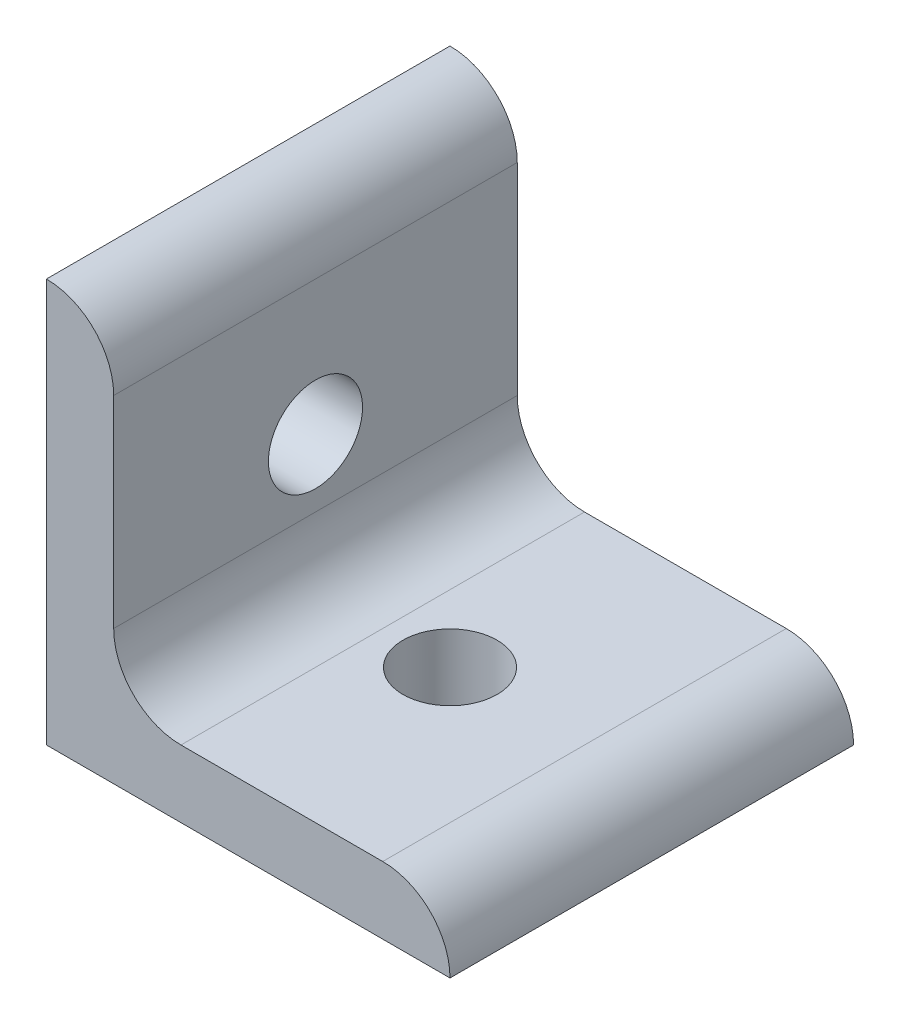
ISO-10303-21;
HEADER;
FILE_DESCRIPTION(('STEP AP214'),'2;1');
FILE_NAME('part.step','',(''),(''),'','','');
FILE_SCHEMA(('AUTOMOTIVE_DESIGN { 1 0 10303 214 1 1 1 1 }'));
ENDSEC;
DATA;
#1=APPLICATION_CONTEXT('core data for automotive mechanical design processes');
#2=APPLICATION_PROTOCOL_DEFINITION('international standard','automotive_design',2000,#1);
#3=PRODUCT_CONTEXT('',#1,'mechanical');
#4=PRODUCT('Part','Part','',(#3));
#5=PRODUCT_RELATED_PRODUCT_CATEGORY('part','',(#4));
#6=PRODUCT_DEFINITION_FORMATION('','',#4);
#7=PRODUCT_DEFINITION_CONTEXT('part definition',#1,'design');
#8=PRODUCT_DEFINITION('design','',#6,#7);
#9=PRODUCT_DEFINITION_SHAPE('','',#8);
#10=(LENGTH_UNIT() NAMED_UNIT(*) SI_UNIT(.MILLI.,.METRE.));
#11=(NAMED_UNIT(*) PLANE_ANGLE_UNIT() SI_UNIT($,.RADIAN.));
#12=(NAMED_UNIT(*) SI_UNIT($,.STERADIAN.) SOLID_ANGLE_UNIT());
#13=UNCERTAINTY_MEASURE_WITH_UNIT(LENGTH_MEASURE(1.E-05),#10,'distance_accuracy_value','');
#14=(GEOMETRIC_REPRESENTATION_CONTEXT(3) GLOBAL_UNCERTAINTY_ASSIGNED_CONTEXT((#13)) GLOBAL_UNIT_ASSIGNED_CONTEXT((#10,
#11,#12)) REPRESENTATION_CONTEXT('',''));
#15=CARTESIAN_POINT('',(0.,0.,0.));
#16=DIRECTION('',(0.,0.,1.));
#17=DIRECTION('',(1.,0.,0.));
#18=AXIS2_PLACEMENT_3D('',#15,#16,#17);
#19=CARTESIAN_POINT('',(5.,25.,15.));
#20=DIRECTION('',(-1.,0.,0.));
#21=DIRECTION('',(0.,-1.,0.));
#22=AXIS2_PLACEMENT_3D('',#19,#20,#21);
#23=PLANE('',#22);
#24=DIRECTION('',(0.,1.,0.));
#25=VECTOR('',#24,1.);
#26=CARTESIAN_POINT('',(5.,25.,-15.));
#27=LINE('',#26,#25);
#28=CARTESIAN_POINT('',(5.,10.,-15.));
#29=VERTEX_POINT('',#28);
#30=CARTESIAN_POINT('',(5.,25.,-15.));
#31=VERTEX_POINT('',#30);
#32=EDGE_CURVE('E114',#29,#31,#27,.T.);
#33=ORIENTED_EDGE('',*,*,#32,.T.);
#34=DIRECTION('',(0.,0.,-1.));
#35=VECTOR('',#34,1.);
#36=CARTESIAN_POINT('',(5.,25.,15.));
#37=LINE('',#36,#35);
#38=CARTESIAN_POINT('',(5.,25.,15.));
#39=VERTEX_POINT('',#38);
#40=EDGE_CURVE('E111',#39,#31,#37,.T.);
#41=ORIENTED_EDGE('',*,*,#40,.F.);
#42=DIRECTION('',(0.,1.,0.));
#43=VECTOR('',#42,1.);
#44=CARTESIAN_POINT('',(5.,25.,15.));
#45=LINE('',#44,#43);
#46=CARTESIAN_POINT('',(5.,10.,15.));
#47=VERTEX_POINT('',#46);
#48=EDGE_CURVE('E100',#47,#39,#45,.T.);
#49=ORIENTED_EDGE('',*,*,#48,.F.);
#50=DIRECTION('',(0.,0.,-1.));
#51=VECTOR('',#50,1.);
#52=CARTESIAN_POINT('',(5.,10.,15.));
#53=LINE('',#52,#51);
#54=EDGE_CURVE('E115',#47,#29,#53,.T.);
#55=ORIENTED_EDGE('',*,*,#54,.T.);
#56=EDGE_LOOP('',(#33,#41,#49,#55));
#57=FACE_BOUND('',#56,.T.);
#58=CARTESIAN_POINT('',(5.,15.,0.));
#59=DIRECTION('',(-1.,0.,0.));
#60=DIRECTION('',(0.,-1.,0.));
#61=AXIS2_PLACEMENT_3D('',#58,#59,#60);
#62=CIRCLE('',#61,3.5);
#63=CARTESIAN_POINT('',(5.,11.5,0.));
#64=VERTEX_POINT('',#63);
#65=EDGE_CURVE('E164',#64,#64,#62,.F.);
#66=ORIENTED_EDGE('',*,*,#65,.F.);
#67=EDGE_LOOP('',(#66));
#68=FACE_BOUND('',#67,.T.);
#69=ADVANCED_FACE('F32',(#57,#68),#23,.F.);
#70=CARTESIAN_POINT('',(0.,0.,15.));
#71=DIRECTION('',(1.,0.,0.));
#72=DIRECTION('',(0.,0.,-1.));
#73=AXIS2_PLACEMENT_3D('',#70,#71,#72);
#74=PLANE('',#73);
#75=DIRECTION('',(0.,-1.,0.));
#76=VECTOR('',#75,1.);
#77=CARTESIAN_POINT('',(0.,0.,-15.));
#78=LINE('',#77,#76);
#79=CARTESIAN_POINT('',(0.,30.,-15.));
#80=VERTEX_POINT('',#79);
#81=CARTESIAN_POINT('',(0.,0.,-15.));
#82=VERTEX_POINT('',#81);
#83=EDGE_CURVE('E82',#80,#82,#78,.T.);
#84=ORIENTED_EDGE('',*,*,#83,.T.);
#85=DIRECTION('',(0.,0.,-1.));
#86=VECTOR('',#85,1.);
#87=CARTESIAN_POINT('',(0.,0.,15.));
#88=LINE('',#87,#86);
#89=CARTESIAN_POINT('',(0.,0.,15.));
#90=VERTEX_POINT('',#89);
#91=EDGE_CURVE('E120',#90,#82,#88,.T.);
#92=ORIENTED_EDGE('',*,*,#91,.F.);
#93=DIRECTION('',(0.,-1.,0.));
#94=VECTOR('',#93,1.);
#95=CARTESIAN_POINT('',(0.,0.,15.));
#96=LINE('',#95,#94);
#97=CARTESIAN_POINT('',(0.,30.,15.));
#98=VERTEX_POINT('',#97);
#99=EDGE_CURVE('E50',#98,#90,#96,.T.);
#100=ORIENTED_EDGE('',*,*,#99,.F.);
#101=DIRECTION('',(0.,0.,-1.));
#102=VECTOR('',#101,1.);
#103=CARTESIAN_POINT('',(0.,30.,15.));
#104=LINE('',#103,#102);
#105=EDGE_CURVE('E116',#98,#80,#104,.T.);
#106=ORIENTED_EDGE('',*,*,#105,.T.);
#107=EDGE_LOOP('',(#84,#92,#100,#106));
#108=FACE_BOUND('',#107,.T.);
#109=CARTESIAN_POINT('',(0.,15.,0.));
#110=DIRECTION('',(1.,0.,0.));
#111=DIRECTION('',(0.,0.,-1.));
#112=AXIS2_PLACEMENT_3D('',#109,#110,#111);
#113=CIRCLE('',#112,3.5);
#114=CARTESIAN_POINT('',(0.,15.,-3.5));
#115=VERTEX_POINT('',#114);
#116=EDGE_CURVE('E167',#115,#115,#113,.T.);
#117=ORIENTED_EDGE('',*,*,#116,.T.);
#118=EDGE_LOOP('',(#117));
#119=FACE_BOUND('',#118,.T.);
#120=ADVANCED_FACE('F171',(#108,#119),#74,.F.);
#121=CARTESIAN_POINT('',(30.,0.,15.));
#122=DIRECTION('',(0.,1.,0.));
#123=DIRECTION('',(-1.,0.,0.));
#124=AXIS2_PLACEMENT_3D('',#121,#122,#123);
#125=PLANE('',#124);
#126=DIRECTION('',(1.,0.,0.));
#127=VECTOR('',#126,1.);
#128=CARTESIAN_POINT('',(30.,0.,-15.));
#129=LINE('',#128,#127);
#130=CARTESIAN_POINT('',(30.,0.,-15.));
#131=VERTEX_POINT('',#130);
#132=EDGE_CURVE('E124',#82,#131,#129,.T.);
#133=ORIENTED_EDGE('',*,*,#132,.T.);
#134=DIRECTION('',(0.,0.,-1.));
#135=VECTOR('',#134,1.);
#136=CARTESIAN_POINT('',(30.,0.,15.));
#137=LINE('',#136,#135);
#138=CARTESIAN_POINT('',(30.,0.,15.));
#139=VERTEX_POINT('',#138);
#140=EDGE_CURVE('E11',#139,#131,#137,.T.);
#141=ORIENTED_EDGE('',*,*,#140,.F.);
#142=DIRECTION('',(1.,0.,0.));
#143=VECTOR('',#142,1.);
#144=CARTESIAN_POINT('',(30.,0.,15.));
#145=LINE('',#144,#143);
#146=EDGE_CURVE('E136',#90,#139,#145,.T.);
#147=ORIENTED_EDGE('',*,*,#146,.F.);
#148=ORIENTED_EDGE('',*,*,#91,.T.);
#149=EDGE_LOOP('',(#133,#141,#147,#148));
#150=FACE_BOUND('',#149,.T.);
#151=CARTESIAN_POINT('',(15.,0.,0.));
#152=DIRECTION('',(0.,1.,0.));
#153=DIRECTION('',(0.,0.,1.));
#154=AXIS2_PLACEMENT_3D('',#151,#152,#153);
#155=CIRCLE('',#154,3.5);
#156=CARTESIAN_POINT('',(15.,0.,3.5));
#157=VERTEX_POINT('',#156);
#158=EDGE_CURVE('E161',#157,#157,#155,.T.);
#159=ORIENTED_EDGE('',*,*,#158,.T.);
#160=EDGE_LOOP('',(#159));
#161=FACE_BOUND('',#160,.T.);
#162=ADVANCED_FACE('F34',(#150,#161),#125,.F.);
#163=CARTESIAN_POINT('',(10.,5.,15.));
#164=DIRECTION('',(0.,-1.,0.));
#165=DIRECTION('',(1.,0.,0.));
#166=AXIS2_PLACEMENT_3D('',#163,#164,#165);
#167=PLANE('',#166);
#168=DIRECTION('',(-1.,0.,0.));
#169=VECTOR('',#168,1.);
#170=CARTESIAN_POINT('',(10.,5.,-15.));
#171=LINE('',#170,#169);
#172=CARTESIAN_POINT('',(25.,5.,-15.));
#173=VERTEX_POINT('',#172);
#174=CARTESIAN_POINT('',(10.,5.,-15.));
#175=VERTEX_POINT('',#174);
#176=EDGE_CURVE('E129',#173,#175,#171,.T.);
#177=ORIENTED_EDGE('',*,*,#176,.T.);
#178=DIRECTION('',(0.,0.,-1.));
#179=VECTOR('',#178,1.);
#180=CARTESIAN_POINT('',(10.,5.,15.));
#181=LINE('',#180,#179);
#182=CARTESIAN_POINT('',(10.,5.,15.));
#183=VERTEX_POINT('',#182);
#184=EDGE_CURVE('E140',#183,#175,#181,.T.);
#185=ORIENTED_EDGE('',*,*,#184,.F.);
#186=DIRECTION('',(-1.,0.,0.));
#187=VECTOR('',#186,1.);
#188=CARTESIAN_POINT('',(10.,5.,15.));
#189=LINE('',#188,#187);
#190=CARTESIAN_POINT('',(25.,5.,15.));
#191=VERTEX_POINT('',#190);
#192=EDGE_CURVE('E150',#191,#183,#189,.T.);
#193=ORIENTED_EDGE('',*,*,#192,.F.);
#194=DIRECTION('',(0.,0.,-1.));
#195=VECTOR('',#194,1.);
#196=CARTESIAN_POINT('',(25.,5.,15.));
#197=LINE('',#196,#195);
#198=EDGE_CURVE('E42',#191,#173,#197,.T.);
#199=ORIENTED_EDGE('',*,*,#198,.T.);
#200=EDGE_LOOP('',(#177,#185,#193,#199));
#201=FACE_BOUND('',#200,.T.);
#202=CARTESIAN_POINT('',(15.,5.,0.));
#203=DIRECTION('',(0.,-1.,0.));
#204=DIRECTION('',(1.,0.,0.));
#205=AXIS2_PLACEMENT_3D('',#202,#203,#204);
#206=CIRCLE('',#205,3.5);
#207=CARTESIAN_POINT('',(18.5,5.,0.));
#208=VERTEX_POINT('',#207);
#209=EDGE_CURVE('E36',#208,#208,#206,.F.);
#210=ORIENTED_EDGE('',*,*,#209,.F.);
#211=EDGE_LOOP('',(#210));
#212=FACE_BOUND('',#211,.T.);
#213=ADVANCED_FACE('F147',(#201,#212),#167,.F.);
#214=CARTESIAN_POINT('',(25.,0.,15.));
#215=DIRECTION('',(0.,0.,-1.));
#216=DIRECTION('',(-1.,0.,0.));
#217=AXIS2_PLACEMENT_3D('',#214,#215,#216);
#218=CYLINDRICAL_SURFACE('',#217,5.);
#219=CARTESIAN_POINT('',(25.,0.,-15.));
#220=DIRECTION('',(0.,0.,1.));
#221=DIRECTION('',(1.,0.,0.));
#222=AXIS2_PLACEMENT_3D('',#219,#220,#221);
#223=CIRCLE('',#222,5.);
#224=EDGE_CURVE('E127',#131,#173,#223,.T.);
#225=ORIENTED_EDGE('',*,*,#224,.T.);
#226=ORIENTED_EDGE('',*,*,#198,.F.);
#227=CARTESIAN_POINT('',(25.,0.,15.));
#228=DIRECTION('',(0.,0.,1.));
#229=DIRECTION('',(1.,0.,0.));
#230=AXIS2_PLACEMENT_3D('',#227,#228,#229);
#231=CIRCLE('',#230,5.);
#232=EDGE_CURVE('E90',#139,#191,#231,.T.);
#233=ORIENTED_EDGE('',*,*,#232,.F.);
#234=ORIENTED_EDGE('',*,*,#140,.T.);
#235=EDGE_LOOP('',(#225,#226,#233,#234));
#236=FACE_BOUND('',#235,.T.);
#237=ADVANCED_FACE('F189',(#236),#218,.T.);
#238=CARTESIAN_POINT('',(10.,10.,15.));
#239=DIRECTION('',(0.,0.,-1.));
#240=DIRECTION('',(-1.,0.,0.));
#241=AXIS2_PLACEMENT_3D('',#238,#239,#240);
#242=CYLINDRICAL_SURFACE('',#241,5.);
#243=CARTESIAN_POINT('',(10.,10.,-15.));
#244=DIRECTION('',(0.,0.,-1.));
#245=DIRECTION('',(1.,0.,0.));
#246=AXIS2_PLACEMENT_3D('',#243,#244,#245);
#247=CIRCLE('',#246,5.);
#248=EDGE_CURVE('E131',#175,#29,#247,.T.);
#249=ORIENTED_EDGE('',*,*,#248,.T.);
#250=ORIENTED_EDGE('',*,*,#54,.F.);
#251=CARTESIAN_POINT('',(10.,10.,15.));
#252=DIRECTION('',(0.,0.,-1.));
#253=DIRECTION('',(1.,0.,0.));
#254=AXIS2_PLACEMENT_3D('',#251,#252,#253);
#255=CIRCLE('',#254,5.);
#256=EDGE_CURVE('E106',#183,#47,#255,.T.);
#257=ORIENTED_EDGE('',*,*,#256,.F.);
#258=ORIENTED_EDGE('',*,*,#184,.T.);
#259=EDGE_LOOP('',(#249,#250,#257,#258));
#260=FACE_BOUND('',#259,.T.);
#261=ADVANCED_FACE('F156',(#260),#242,.F.);
#262=CARTESIAN_POINT('',(0.,25.,15.));
#263=DIRECTION('',(0.,0.,-1.));
#264=DIRECTION('',(-1.,0.,0.));
#265=AXIS2_PLACEMENT_3D('',#262,#263,#264);
#266=CYLINDRICAL_SURFACE('',#265,5.);
#267=CARTESIAN_POINT('',(0.,25.,-15.));
#268=DIRECTION('',(0.,0.,1.));
#269=DIRECTION('',(1.,0.,0.));
#270=AXIS2_PLACEMENT_3D('',#267,#268,#269);
#271=CIRCLE('',#270,5.);
#272=EDGE_CURVE('E76',#31,#80,#271,.T.);
#273=ORIENTED_EDGE('',*,*,#272,.T.);
#274=ORIENTED_EDGE('',*,*,#105,.F.);
#275=CARTESIAN_POINT('',(0.,25.,15.));
#276=DIRECTION('',(0.,0.,1.));
#277=DIRECTION('',(1.,0.,0.));
#278=AXIS2_PLACEMENT_3D('',#275,#276,#277);
#279=CIRCLE('',#278,5.);
#280=EDGE_CURVE('E104',#39,#98,#279,.T.);
#281=ORIENTED_EDGE('',*,*,#280,.F.);
#282=ORIENTED_EDGE('',*,*,#40,.T.);
#283=EDGE_LOOP('',(#273,#274,#281,#282));
#284=FACE_BOUND('',#283,.T.);
#285=ADVANCED_FACE('F118',(#284),#266,.T.);
#286=CARTESIAN_POINT('',(0.,25.,15.));
#287=DIRECTION('',(0.,0.,1.));
#288=DIRECTION('',(1.,0.,0.));
#289=AXIS2_PLACEMENT_3D('',#286,#287,#288);
#290=PLANE('',#289);
#291=ORIENTED_EDGE('',*,*,#146,.T.);
#292=ORIENTED_EDGE('',*,*,#232,.T.);
#293=ORIENTED_EDGE('',*,*,#192,.T.);
#294=ORIENTED_EDGE('',*,*,#256,.T.);
#295=ORIENTED_EDGE('',*,*,#48,.T.);
#296=ORIENTED_EDGE('',*,*,#280,.T.);
#297=ORIENTED_EDGE('',*,*,#99,.T.);
#298=EDGE_LOOP('',(#291,#292,#293,#294,#295,#296,#297));
#299=FACE_BOUND('',#298,.T.);
#300=ADVANCED_FACE('F102',(#299),#290,.T.);
#301=CARTESIAN_POINT('',(0.,25.,-15.));
#302=DIRECTION('',(0.,0.,1.));
#303=DIRECTION('',(1.,0.,0.));
#304=AXIS2_PLACEMENT_3D('',#301,#302,#303);
#305=PLANE('',#304);
#306=ORIENTED_EDGE('',*,*,#132,.F.);
#307=ORIENTED_EDGE('',*,*,#83,.F.);
#308=ORIENTED_EDGE('',*,*,#272,.F.);
#309=ORIENTED_EDGE('',*,*,#32,.F.);
#310=ORIENTED_EDGE('',*,*,#248,.F.);
#311=ORIENTED_EDGE('',*,*,#176,.F.);
#312=ORIENTED_EDGE('',*,*,#224,.F.);
#313=EDGE_LOOP('',(#306,#307,#308,#309,#310,#311,#312));
#314=FACE_BOUND('',#313,.T.);
#315=ADVANCED_FACE('F154',(#314),#305,.F.);
#316=CARTESIAN_POINT('',(15.,30.,0.));
#317=DIRECTION('',(0.,-1.,0.));
#318=DIRECTION('',(0.,0.,-1.));
#319=AXIS2_PLACEMENT_3D('',#316,#317,#318);
#320=CYLINDRICAL_SURFACE('',#319,3.5);
#321=ORIENTED_EDGE('',*,*,#158,.F.);
#322=EDGE_LOOP('',(#321));
#323=FACE_BOUND('',#322,.T.);
#324=ORIENTED_EDGE('',*,*,#209,.T.);
#325=EDGE_LOOP('',(#324));
#326=FACE_BOUND('',#325,.T.);
#327=ADVANCED_FACE('F176',(#323,#326),#320,.F.);
#328=CARTESIAN_POINT('',(30.,15.,0.));
#329=DIRECTION('',(-1.,0.,0.));
#330=DIRECTION('',(0.,0.,1.));
#331=AXIS2_PLACEMENT_3D('',#328,#329,#330);
#332=CYLINDRICAL_SURFACE('',#331,3.5);
#333=ORIENTED_EDGE('',*,*,#116,.F.);
#334=EDGE_LOOP('',(#333));
#335=FACE_BOUND('',#334,.T.);
#336=ORIENTED_EDGE('',*,*,#65,.T.);
#337=EDGE_LOOP('',(#336));
#338=FACE_BOUND('',#337,.T.);
#339=ADVANCED_FACE('F173',(#335,#338),#332,.F.);
#340=CLOSED_SHELL('',(#69,#120,#162,#213,#237,#261,#285,#300,#315,#327,#339));
#341=MANIFOLD_SOLID_BREP('B2',#340);
#342=ADVANCED_BREP_SHAPE_REPRESENTATION('',(#18,#341),#14);
#343=SHAPE_DEFINITION_REPRESENTATION(#9,#342);
ENDSEC;
END-ISO-10303-21;
